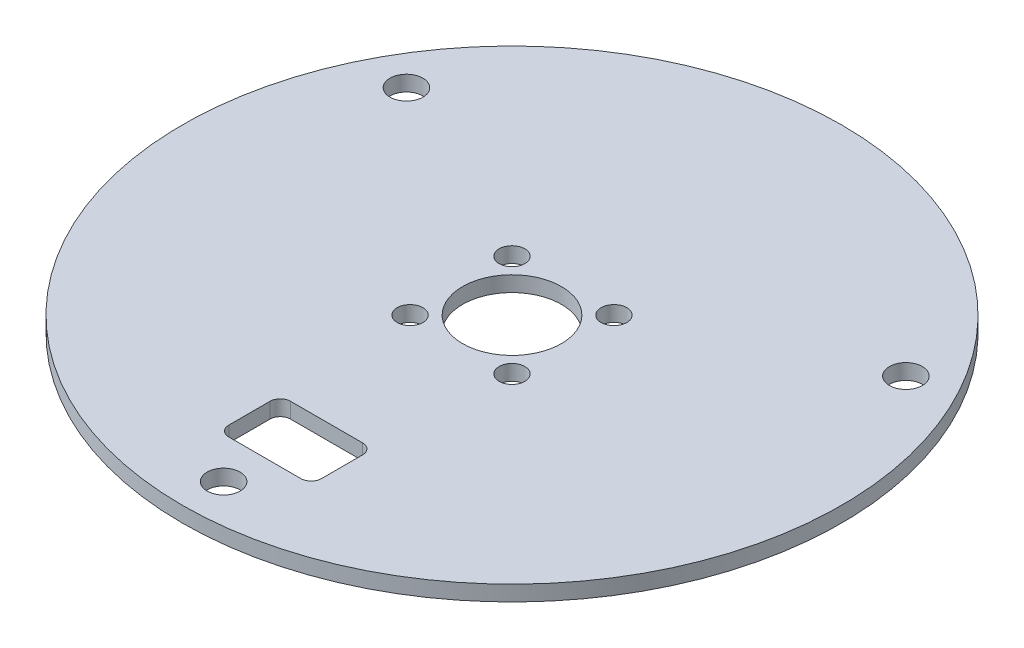
ISO-10303-21;
HEADER;
FILE_DESCRIPTION(('STEP AP214'),'2;1');
FILE_NAME('part.step','',(''),(''),'','','');
FILE_SCHEMA(('AUTOMOTIVE_DESIGN { 1 0 10303 214 1 1 1 1 }'));
ENDSEC;
DATA;
#1=APPLICATION_CONTEXT('core data for automotive mechanical design processes');
#2=APPLICATION_PROTOCOL_DEFINITION('international standard','automotive_design',2000,#1);
#3=PRODUCT_CONTEXT('',#1,'mechanical');
#4=PRODUCT('Part','Part','',(#3));
#5=PRODUCT_RELATED_PRODUCT_CATEGORY('part','',(#4));
#6=PRODUCT_DEFINITION_FORMATION('','',#4);
#7=PRODUCT_DEFINITION_CONTEXT('part definition',#1,'design');
#8=PRODUCT_DEFINITION('design','',#6,#7);
#9=PRODUCT_DEFINITION_SHAPE('','',#8);
#10=(LENGTH_UNIT() NAMED_UNIT(*) SI_UNIT(.MILLI.,.METRE.));
#11=(NAMED_UNIT(*) PLANE_ANGLE_UNIT() SI_UNIT($,.RADIAN.));
#12=(NAMED_UNIT(*) SI_UNIT($,.STERADIAN.) SOLID_ANGLE_UNIT());
#13=UNCERTAINTY_MEASURE_WITH_UNIT(LENGTH_MEASURE(1.E-05),#10,'distance_accuracy_value','');
#14=(GEOMETRIC_REPRESENTATION_CONTEXT(3) GLOBAL_UNCERTAINTY_ASSIGNED_CONTEXT((#13)) GLOBAL_UNIT_ASSIGNED_CONTEXT((#10,
#11,#12)) REPRESENTATION_CONTEXT('',''));
#15=CARTESIAN_POINT('',(0.,0.,0.));
#16=DIRECTION('',(0.,0.,1.));
#17=DIRECTION('',(1.,0.,0.));
#18=AXIS2_PLACEMENT_3D('',#15,#16,#17);
#19=CARTESIAN_POINT('',(0.,-1.5,0.));
#20=DIRECTION('',(0.,1.,0.));
#21=DIRECTION('',(0.,0.,1.));
#22=AXIS2_PLACEMENT_3D('',#19,#20,#21);
#23=CYLINDRICAL_SURFACE('',#22,32.);
#24=CARTESIAN_POINT('',(0.,-1.5,0.));
#25=DIRECTION('',(0.,1.,0.));
#26=DIRECTION('',(0.,0.,1.));
#27=AXIS2_PLACEMENT_3D('',#24,#25,#26);
#28=CIRCLE('',#27,32.);
#29=CARTESIAN_POINT('',(0.,-1.5,32.));
#30=VERTEX_POINT('',#29);
#31=EDGE_CURVE('E200',#30,#30,#28,.T.);
#32=ORIENTED_EDGE('',*,*,#31,.T.);
#33=EDGE_LOOP('',(#32));
#34=FACE_BOUND('',#33,.T.);
#35=CARTESIAN_POINT('',(0.,0.,0.));
#36=DIRECTION('',(0.,1.,0.));
#37=DIRECTION('',(0.,0.,1.));
#38=AXIS2_PLACEMENT_3D('',#35,#36,#37);
#39=CIRCLE('',#38,32.);
#40=CARTESIAN_POINT('',(0.,0.,32.));
#41=VERTEX_POINT('',#40);
#42=EDGE_CURVE('E185',#41,#41,#39,.T.);
#43=ORIENTED_EDGE('',*,*,#42,.F.);
#44=EDGE_LOOP('',(#43));
#45=FACE_BOUND('',#44,.T.);
#46=ADVANCED_FACE('F47',(#34,#45),#23,.T.);
#47=CARTESIAN_POINT('',(0.,-1.5,0.));
#48=DIRECTION('',(0.,1.,0.));
#49=DIRECTION('',(0.,0.,1.));
#50=AXIS2_PLACEMENT_3D('',#47,#48,#49);
#51=PLANE('',#50);
#52=DIRECTION('',(0.,0.,-1.));
#53=VECTOR('',#52,1.);
#54=CARTESIAN_POINT('',(4.5,-1.5,18.));
#55=LINE('',#54,#53);
#56=CARTESIAN_POINT('',(4.5,-1.5,23.));
#57=VERTEX_POINT('',#56);
#58=CARTESIAN_POINT('',(4.5,-1.5,19.));
#59=VERTEX_POINT('',#58);
#60=EDGE_CURVE('E235',#57,#59,#55,.T.);
#61=ORIENTED_EDGE('',*,*,#60,.T.);
#62=CARTESIAN_POINT('',(3.5,-1.5,19.));
#63=DIRECTION('',(0.,1.,0.));
#64=DIRECTION('',(0.,0.,1.));
#65=AXIS2_PLACEMENT_3D('',#62,#63,#64);
#66=CIRCLE('',#65,1.);
#67=CARTESIAN_POINT('',(3.5,-1.5,18.));
#68=VERTEX_POINT('',#67);
#69=EDGE_CURVE('E11',#59,#68,#66,.T.);
#70=ORIENTED_EDGE('',*,*,#69,.T.);
#71=DIRECTION('',(-1.,0.,0.));
#72=VECTOR('',#71,1.);
#73=CARTESIAN_POINT('',(-4.5,-1.5,18.));
#74=LINE('',#73,#72);
#75=CARTESIAN_POINT('',(-3.5,-1.5,18.));
#76=VERTEX_POINT('',#75);
#77=EDGE_CURVE('E175',#68,#76,#74,.T.);
#78=ORIENTED_EDGE('',*,*,#77,.T.);
#79=CARTESIAN_POINT('',(-3.5,-1.5,19.));
#80=DIRECTION('',(0.,1.,0.));
#81=DIRECTION('',(0.,0.,1.));
#82=AXIS2_PLACEMENT_3D('',#79,#80,#81);
#83=CIRCLE('',#82,1.);
#84=CARTESIAN_POINT('',(-4.5,-1.5,19.));
#85=VERTEX_POINT('',#84);
#86=EDGE_CURVE('E224',#76,#85,#83,.T.);
#87=ORIENTED_EDGE('',*,*,#86,.T.);
#88=DIRECTION('',(0.,0.,1.));
#89=VECTOR('',#88,1.);
#90=CARTESIAN_POINT('',(-4.5,-1.5,18.));
#91=LINE('',#90,#89);
#92=CARTESIAN_POINT('',(-4.5,-1.5,23.));
#93=VERTEX_POINT('',#92);
#94=EDGE_CURVE('E149',#85,#93,#91,.T.);
#95=ORIENTED_EDGE('',*,*,#94,.T.);
#96=CARTESIAN_POINT('',(-3.5,-1.5,23.));
#97=DIRECTION('',(0.,1.,0.));
#98=DIRECTION('',(0.,0.,1.));
#99=AXIS2_PLACEMENT_3D('',#96,#97,#98);
#100=CIRCLE('',#99,1.);
#101=CARTESIAN_POINT('',(-3.5,-1.5,24.));
#102=VERTEX_POINT('',#101);
#103=EDGE_CURVE('E122',#93,#102,#100,.T.);
#104=ORIENTED_EDGE('',*,*,#103,.T.);
#105=DIRECTION('',(1.,0.,0.));
#106=VECTOR('',#105,1.);
#107=CARTESIAN_POINT('',(-4.5,-1.5,24.));
#108=LINE('',#107,#106);
#109=CARTESIAN_POINT('',(3.5,-1.5,24.));
#110=VERTEX_POINT('',#109);
#111=EDGE_CURVE('E131',#102,#110,#108,.T.);
#112=ORIENTED_EDGE('',*,*,#111,.T.);
#113=CARTESIAN_POINT('',(3.5,-1.5,23.));
#114=DIRECTION('',(0.,1.,0.));
#115=DIRECTION('',(0.,0.,1.));
#116=AXIS2_PLACEMENT_3D('',#113,#114,#115);
#117=CIRCLE('',#116,1.);
#118=EDGE_CURVE('E220',#110,#57,#117,.T.);
#119=ORIENTED_EDGE('',*,*,#118,.T.);
#120=EDGE_LOOP('',(#61,#70,#78,#87,#95,#104,#112,#119));
#121=FACE_BOUND('',#120,.T.);
#122=CARTESIAN_POINT('',(-4.94974746830583,-1.5,4.94974746830583));
#123=DIRECTION('',(0.,1.,0.));
#124=DIRECTION('',(0.,0.,1.));
#125=AXIS2_PLACEMENT_3D('',#122,#123,#124);
#126=CIRCLE('',#125,1.25);
#127=CARTESIAN_POINT('',(-4.94974746830583,-1.5,6.19974746830583));
#128=VERTEX_POINT('',#127);
#129=EDGE_CURVE('E172',#128,#128,#126,.T.);
#130=ORIENTED_EDGE('',*,*,#129,.T.);
#131=EDGE_LOOP('',(#130));
#132=FACE_BOUND('',#131,.T.);
#133=CARTESIAN_POINT('',(4.94974746830583,-1.5,4.94974746830583));
#134=DIRECTION('',(0.,1.,0.));
#135=DIRECTION('',(0.,0.,1.));
#136=AXIS2_PLACEMENT_3D('',#133,#134,#135);
#137=CIRCLE('',#136,1.25);
#138=CARTESIAN_POINT('',(4.94974746830583,-1.5,6.19974746830583));
#139=VERTEX_POINT('',#138);
#140=EDGE_CURVE('E166',#139,#139,#137,.T.);
#141=ORIENTED_EDGE('',*,*,#140,.T.);
#142=EDGE_LOOP('',(#141));
#143=FACE_BOUND('',#142,.T.);
#144=CARTESIAN_POINT('',(4.94974746830583,-1.5,-4.94974746830583));
#145=DIRECTION('',(0.,1.,0.));
#146=DIRECTION('',(0.,0.,1.));
#147=AXIS2_PLACEMENT_3D('',#144,#145,#146);
#148=CIRCLE('',#147,1.25);
#149=CARTESIAN_POINT('',(4.94974746830583,-1.5,-3.69974746830583));
#150=VERTEX_POINT('',#149);
#151=EDGE_CURVE('E160',#150,#150,#148,.T.);
#152=ORIENTED_EDGE('',*,*,#151,.T.);
#153=EDGE_LOOP('',(#152));
#154=FACE_BOUND('',#153,.T.);
#155=CARTESIAN_POINT('',(-4.94974746830583,-1.5,-4.94974746830583));
#156=DIRECTION('',(0.,1.,0.));
#157=DIRECTION('',(0.,0.,1.));
#158=AXIS2_PLACEMENT_3D('',#155,#156,#157);
#159=CIRCLE('',#158,1.25);
#160=CARTESIAN_POINT('',(-4.94974746830583,-1.5,-3.69974746830583));
#161=VERTEX_POINT('',#160);
#162=EDGE_CURVE('E154',#161,#161,#159,.T.);
#163=ORIENTED_EDGE('',*,*,#162,.T.);
#164=EDGE_LOOP('',(#163));
#165=FACE_BOUND('',#164,.T.);
#166=CARTESIAN_POINT('',(0.,-1.5,0.));
#167=DIRECTION('',(0.,1.,0.));
#168=DIRECTION('',(0.,0.,1.));
#169=AXIS2_PLACEMENT_3D('',#166,#167,#168);
#170=CIRCLE('',#169,4.8);
#171=CARTESIAN_POINT('',(0.,-1.5,4.8));
#172=VERTEX_POINT('',#171);
#173=EDGE_CURVE('E176',#172,#172,#170,.T.);
#174=ORIENTED_EDGE('',*,*,#173,.T.);
#175=EDGE_LOOP('',(#174));
#176=FACE_BOUND('',#175,.T.);
#177=CARTESIAN_POINT('',(0.,-1.5,28.));
#178=DIRECTION('',(0.,1.,0.));
#179=DIRECTION('',(0.,0.,1.));
#180=AXIS2_PLACEMENT_3D('',#177,#178,#179);
#181=CIRCLE('',#180,1.6);
#182=CARTESIAN_POINT('',(0.,-1.5,29.6));
#183=VERTEX_POINT('',#182);
#184=EDGE_CURVE('E182',#183,#183,#181,.T.);
#185=ORIENTED_EDGE('',*,*,#184,.T.);
#186=EDGE_LOOP('',(#185));
#187=FACE_BOUND('',#186,.T.);
#188=CARTESIAN_POINT('',(-24.2487113059642,-1.5,-14.0000000000001));
#189=DIRECTION('',(0.,1.,0.));
#190=DIRECTION('',(0.,0.,1.));
#191=AXIS2_PLACEMENT_3D('',#188,#189,#190);
#192=CIRCLE('',#191,1.6);
#193=CARTESIAN_POINT('',(-24.2487113059642,-1.5,-12.4000000000001));
#194=VERTEX_POINT('',#193);
#195=EDGE_CURVE('E192',#194,#194,#192,.T.);
#196=ORIENTED_EDGE('',*,*,#195,.T.);
#197=EDGE_LOOP('',(#196));
#198=FACE_BOUND('',#197,.T.);
#199=CARTESIAN_POINT('',(24.2487113059644,-1.5,-13.9999999999998));
#200=DIRECTION('',(0.,1.,0.));
#201=DIRECTION('',(0.,0.,1.));
#202=AXIS2_PLACEMENT_3D('',#199,#200,#201);
#203=CIRCLE('',#202,1.6);
#204=CARTESIAN_POINT('',(24.2487113059644,-1.5,-12.3999999999998));
#205=VERTEX_POINT('',#204);
#206=EDGE_CURVE('E179',#205,#205,#203,.T.);
#207=ORIENTED_EDGE('',*,*,#206,.T.);
#208=EDGE_LOOP('',(#207));
#209=FACE_BOUND('',#208,.T.);
#210=ORIENTED_EDGE('',*,*,#31,.F.);
#211=EDGE_LOOP('',(#210));
#212=FACE_BOUND('',#211,.T.);
#213=ADVANCED_FACE('F241',(#121,#132,#143,#154,#165,#176,#187,#198,#209,#212),#51,.F.);
#214=CARTESIAN_POINT('',(0.,0.,0.));
#215=DIRECTION('',(0.,1.,0.));
#216=DIRECTION('',(0.,0.,1.));
#217=AXIS2_PLACEMENT_3D('',#214,#215,#216);
#218=PLANE('',#217);
#219=DIRECTION('',(0.,0.,1.));
#220=VECTOR('',#219,1.);
#221=CARTESIAN_POINT('',(-4.5,0.,18.));
#222=LINE('',#221,#220);
#223=CARTESIAN_POINT('',(-4.5,0.,19.));
#224=VERTEX_POINT('',#223);
#225=CARTESIAN_POINT('',(-4.5,0.,23.));
#226=VERTEX_POINT('',#225);
#227=EDGE_CURVE('E140',#224,#226,#222,.T.);
#228=ORIENTED_EDGE('',*,*,#227,.F.);
#229=CARTESIAN_POINT('',(-3.5,0.,19.));
#230=DIRECTION('',(0.,1.,0.));
#231=DIRECTION('',(0.,0.,1.));
#232=AXIS2_PLACEMENT_3D('',#229,#230,#231);
#233=CIRCLE('',#232,1.);
#234=CARTESIAN_POINT('',(-3.5,0.,18.));
#235=VERTEX_POINT('',#234);
#236=EDGE_CURVE('E222',#224,#235,#233,.F.);
#237=ORIENTED_EDGE('',*,*,#236,.T.);
#238=DIRECTION('',(-1.,0.,0.));
#239=VECTOR('',#238,1.);
#240=CARTESIAN_POINT('',(-4.5,0.,18.));
#241=LINE('',#240,#239);
#242=CARTESIAN_POINT('',(3.5,0.,18.));
#243=VERTEX_POINT('',#242);
#244=EDGE_CURVE('E143',#243,#235,#241,.T.);
#245=ORIENTED_EDGE('',*,*,#244,.F.);
#246=CARTESIAN_POINT('',(3.5,0.,19.));
#247=DIRECTION('',(0.,1.,0.));
#248=DIRECTION('',(0.,0.,1.));
#249=AXIS2_PLACEMENT_3D('',#246,#247,#248);
#250=CIRCLE('',#249,1.);
#251=CARTESIAN_POINT('',(4.5,0.,19.));
#252=VERTEX_POINT('',#251);
#253=EDGE_CURVE('E55',#243,#252,#250,.F.);
#254=ORIENTED_EDGE('',*,*,#253,.T.);
#255=DIRECTION('',(0.,0.,-1.));
#256=VECTOR('',#255,1.);
#257=CARTESIAN_POINT('',(4.5,0.,18.));
#258=LINE('',#257,#256);
#259=CARTESIAN_POINT('',(4.5,0.,23.));
#260=VERTEX_POINT('',#259);
#261=EDGE_CURVE('E139',#260,#252,#258,.T.);
#262=ORIENTED_EDGE('',*,*,#261,.F.);
#263=CARTESIAN_POINT('',(3.5,0.,23.));
#264=DIRECTION('',(0.,1.,0.));
#265=DIRECTION('',(0.,0.,1.));
#266=AXIS2_PLACEMENT_3D('',#263,#264,#265);
#267=CIRCLE('',#266,1.);
#268=CARTESIAN_POINT('',(3.5,0.,24.));
#269=VERTEX_POINT('',#268);
#270=EDGE_CURVE('E138',#260,#269,#267,.F.);
#271=ORIENTED_EDGE('',*,*,#270,.T.);
#272=DIRECTION('',(1.,0.,0.));
#273=VECTOR('',#272,1.);
#274=CARTESIAN_POINT('',(-4.5,0.,24.));
#275=LINE('',#274,#273);
#276=CARTESIAN_POINT('',(-3.5,0.,24.));
#277=VERTEX_POINT('',#276);
#278=EDGE_CURVE('E128',#277,#269,#275,.T.);
#279=ORIENTED_EDGE('',*,*,#278,.F.);
#280=CARTESIAN_POINT('',(-3.5,0.,23.));
#281=DIRECTION('',(0.,1.,0.));
#282=DIRECTION('',(0.,0.,1.));
#283=AXIS2_PLACEMENT_3D('',#280,#281,#282);
#284=CIRCLE('',#283,1.);
#285=EDGE_CURVE('E112',#277,#226,#284,.F.);
#286=ORIENTED_EDGE('',*,*,#285,.T.);
#287=EDGE_LOOP('',(#228,#237,#245,#254,#262,#271,#279,#286));
#288=FACE_BOUND('',#287,.T.);
#289=CARTESIAN_POINT('',(-4.94974746830583,0.,4.94974746830583));
#290=DIRECTION('',(0.,1.,0.));
#291=DIRECTION('',(0.,0.,1.));
#292=AXIS2_PLACEMENT_3D('',#289,#290,#291);
#293=CIRCLE('',#292,1.25);
#294=CARTESIAN_POINT('',(-4.94974746830583,0.,6.19974746830583));
#295=VERTEX_POINT('',#294);
#296=EDGE_CURVE('E169',#295,#295,#293,.T.);
#297=ORIENTED_EDGE('',*,*,#296,.F.);
#298=EDGE_LOOP('',(#297));
#299=FACE_BOUND('',#298,.T.);
#300=CARTESIAN_POINT('',(4.94974746830583,0.,4.94974746830583));
#301=DIRECTION('',(0.,1.,0.));
#302=DIRECTION('',(0.,0.,1.));
#303=AXIS2_PLACEMENT_3D('',#300,#301,#302);
#304=CIRCLE('',#303,1.25);
#305=CARTESIAN_POINT('',(4.94974746830583,0.,6.19974746830583));
#306=VERTEX_POINT('',#305);
#307=EDGE_CURVE('E163',#306,#306,#304,.T.);
#308=ORIENTED_EDGE('',*,*,#307,.F.);
#309=EDGE_LOOP('',(#308));
#310=FACE_BOUND('',#309,.T.);
#311=CARTESIAN_POINT('',(4.94974746830583,0.,-4.94974746830583));
#312=DIRECTION('',(0.,1.,0.));
#313=DIRECTION('',(0.,0.,1.));
#314=AXIS2_PLACEMENT_3D('',#311,#312,#313);
#315=CIRCLE('',#314,1.25);
#316=CARTESIAN_POINT('',(4.94974746830583,0.,-3.69974746830583));
#317=VERTEX_POINT('',#316);
#318=EDGE_CURVE('E157',#317,#317,#315,.T.);
#319=ORIENTED_EDGE('',*,*,#318,.F.);
#320=EDGE_LOOP('',(#319));
#321=FACE_BOUND('',#320,.T.);
#322=CARTESIAN_POINT('',(-4.94974746830583,0.,-4.94974746830583));
#323=DIRECTION('',(0.,1.,0.));
#324=DIRECTION('',(0.,0.,1.));
#325=AXIS2_PLACEMENT_3D('',#322,#323,#324);
#326=CIRCLE('',#325,1.25);
#327=CARTESIAN_POINT('',(-4.94974746830583,0.,-3.69974746830583));
#328=VERTEX_POINT('',#327);
#329=EDGE_CURVE('E150',#328,#328,#326,.T.);
#330=ORIENTED_EDGE('',*,*,#329,.F.);
#331=EDGE_LOOP('',(#330));
#332=FACE_BOUND('',#331,.T.);
#333=CARTESIAN_POINT('',(0.,0.,0.));
#334=DIRECTION('',(0.,1.,0.));
#335=DIRECTION('',(0.,0.,1.));
#336=AXIS2_PLACEMENT_3D('',#333,#334,#335);
#337=CIRCLE('',#336,4.8);
#338=CARTESIAN_POINT('',(0.,0.,4.8));
#339=VERTEX_POINT('',#338);
#340=EDGE_CURVE('E153',#339,#339,#337,.T.);
#341=ORIENTED_EDGE('',*,*,#340,.F.);
#342=EDGE_LOOP('',(#341));
#343=FACE_BOUND('',#342,.T.);
#344=CARTESIAN_POINT('',(0.,0.,28.));
#345=DIRECTION('',(0.,1.,0.));
#346=DIRECTION('',(0.,0.,1.));
#347=AXIS2_PLACEMENT_3D('',#344,#345,#346);
#348=CIRCLE('',#347,1.6);
#349=CARTESIAN_POINT('',(0.,0.,29.6));
#350=VERTEX_POINT('',#349);
#351=EDGE_CURVE('E186',#350,#350,#348,.T.);
#352=ORIENTED_EDGE('',*,*,#351,.F.);
#353=EDGE_LOOP('',(#352));
#354=FACE_BOUND('',#353,.T.);
#355=CARTESIAN_POINT('',(-24.2487113059642,0.,-14.0000000000001));
#356=DIRECTION('',(0.,1.,0.));
#357=DIRECTION('',(0.,0.,1.));
#358=AXIS2_PLACEMENT_3D('',#355,#356,#357);
#359=CIRCLE('',#358,1.6);
#360=CARTESIAN_POINT('',(-24.2487113059642,0.,-12.4000000000001));
#361=VERTEX_POINT('',#360);
#362=EDGE_CURVE('E189',#361,#361,#359,.T.);
#363=ORIENTED_EDGE('',*,*,#362,.F.);
#364=EDGE_LOOP('',(#363));
#365=FACE_BOUND('',#364,.T.);
#366=CARTESIAN_POINT('',(24.2487113059644,0.,-13.9999999999998));
#367=DIRECTION('',(0.,1.,0.));
#368=DIRECTION('',(0.,0.,1.));
#369=AXIS2_PLACEMENT_3D('',#366,#367,#368);
#370=CIRCLE('',#369,1.6);
#371=CARTESIAN_POINT('',(24.2487113059644,0.,-12.3999999999998));
#372=VERTEX_POINT('',#371);
#373=EDGE_CURVE('E195',#372,#372,#370,.T.);
#374=ORIENTED_EDGE('',*,*,#373,.F.);
#375=EDGE_LOOP('',(#374));
#376=FACE_BOUND('',#375,.T.);
#377=ORIENTED_EDGE('',*,*,#42,.T.);
#378=EDGE_LOOP('',(#377));
#379=FACE_BOUND('',#378,.T.);
#380=ADVANCED_FACE('F135',(#288,#299,#310,#321,#332,#343,#354,#365,#376,#379),#218,.T.);
#381=CARTESIAN_POINT('',(24.2487113059644,-1.5,-13.9999999999998));
#382=DIRECTION('',(0.,1.,0.));
#383=DIRECTION('',(0.,0.,1.));
#384=AXIS2_PLACEMENT_3D('',#381,#382,#383);
#385=CYLINDRICAL_SURFACE('',#384,1.6);
#386=ORIENTED_EDGE('',*,*,#206,.F.);
#387=EDGE_LOOP('',(#386));
#388=FACE_BOUND('',#387,.T.);
#389=ORIENTED_EDGE('',*,*,#373,.T.);
#390=EDGE_LOOP('',(#389));
#391=FACE_BOUND('',#390,.T.);
#392=ADVANCED_FACE('F306',(#388,#391),#385,.F.);
#393=CARTESIAN_POINT('',(-24.2487113059642,-1.5,-14.0000000000001));
#394=DIRECTION('',(0.,1.,0.));
#395=DIRECTION('',(0.,0.,1.));
#396=AXIS2_PLACEMENT_3D('',#393,#394,#395);
#397=CYLINDRICAL_SURFACE('',#396,1.6);
#398=ORIENTED_EDGE('',*,*,#195,.F.);
#399=EDGE_LOOP('',(#398));
#400=FACE_BOUND('',#399,.T.);
#401=ORIENTED_EDGE('',*,*,#362,.T.);
#402=EDGE_LOOP('',(#401));
#403=FACE_BOUND('',#402,.T.);
#404=ADVANCED_FACE('F302',(#400,#403),#397,.F.);
#405=CARTESIAN_POINT('',(0.,-1.5,28.));
#406=DIRECTION('',(0.,1.,0.));
#407=DIRECTION('',(0.,0.,1.));
#408=AXIS2_PLACEMENT_3D('',#405,#406,#407);
#409=CYLINDRICAL_SURFACE('',#408,1.6);
#410=ORIENTED_EDGE('',*,*,#184,.F.);
#411=EDGE_LOOP('',(#410));
#412=FACE_BOUND('',#411,.T.);
#413=ORIENTED_EDGE('',*,*,#351,.T.);
#414=EDGE_LOOP('',(#413));
#415=FACE_BOUND('',#414,.T.);
#416=ADVANCED_FACE('F298',(#412,#415),#409,.F.);
#417=CARTESIAN_POINT('',(0.,-1.5,0.));
#418=DIRECTION('',(0.,1.,0.));
#419=DIRECTION('',(0.,0.,1.));
#420=AXIS2_PLACEMENT_3D('',#417,#418,#419);
#421=CYLINDRICAL_SURFACE('',#420,4.8);
#422=ORIENTED_EDGE('',*,*,#173,.F.);
#423=EDGE_LOOP('',(#422));
#424=FACE_BOUND('',#423,.T.);
#425=ORIENTED_EDGE('',*,*,#340,.T.);
#426=EDGE_LOOP('',(#425));
#427=FACE_BOUND('',#426,.T.);
#428=ADVANCED_FACE('F284',(#424,#427),#421,.F.);
#429=CARTESIAN_POINT('',(-4.94974746830583,-1.5,-4.94974746830583));
#430=DIRECTION('',(0.,1.,0.));
#431=DIRECTION('',(0.,0.,1.));
#432=AXIS2_PLACEMENT_3D('',#429,#430,#431);
#433=CYLINDRICAL_SURFACE('',#432,1.25);
#434=ORIENTED_EDGE('',*,*,#162,.F.);
#435=EDGE_LOOP('',(#434));
#436=FACE_BOUND('',#435,.T.);
#437=ORIENTED_EDGE('',*,*,#329,.T.);
#438=EDGE_LOOP('',(#437));
#439=FACE_BOUND('',#438,.T.);
#440=ADVANCED_FACE('F280',(#436,#439),#433,.F.);
#441=CARTESIAN_POINT('',(4.94974746830583,-1.5,-4.94974746830583));
#442=DIRECTION('',(0.,1.,0.));
#443=DIRECTION('',(0.,0.,1.));
#444=AXIS2_PLACEMENT_3D('',#441,#442,#443);
#445=CYLINDRICAL_SURFACE('',#444,1.25);
#446=ORIENTED_EDGE('',*,*,#151,.F.);
#447=EDGE_LOOP('',(#446));
#448=FACE_BOUND('',#447,.T.);
#449=ORIENTED_EDGE('',*,*,#318,.T.);
#450=EDGE_LOOP('',(#449));
#451=FACE_BOUND('',#450,.T.);
#452=ADVANCED_FACE('F283',(#448,#451),#445,.F.);
#453=CARTESIAN_POINT('',(4.94974746830583,-1.5,4.94974746830583));
#454=DIRECTION('',(0.,1.,0.));
#455=DIRECTION('',(0.,0.,1.));
#456=AXIS2_PLACEMENT_3D('',#453,#454,#455);
#457=CYLINDRICAL_SURFACE('',#456,1.25);
#458=ORIENTED_EDGE('',*,*,#140,.F.);
#459=EDGE_LOOP('',(#458));
#460=FACE_BOUND('',#459,.T.);
#461=ORIENTED_EDGE('',*,*,#307,.T.);
#462=EDGE_LOOP('',(#461));
#463=FACE_BOUND('',#462,.T.);
#464=ADVANCED_FACE('F288',(#460,#463),#457,.F.);
#465=CARTESIAN_POINT('',(-4.94974746830583,-1.5,4.94974746830583));
#466=DIRECTION('',(0.,1.,0.));
#467=DIRECTION('',(0.,0.,1.));
#468=AXIS2_PLACEMENT_3D('',#465,#466,#467);
#469=CYLINDRICAL_SURFACE('',#468,1.25);
#470=ORIENTED_EDGE('',*,*,#129,.F.);
#471=EDGE_LOOP('',(#470));
#472=FACE_BOUND('',#471,.T.);
#473=ORIENTED_EDGE('',*,*,#296,.T.);
#474=EDGE_LOOP('',(#473));
#475=FACE_BOUND('',#474,.T.);
#476=ADVANCED_FACE('F279',(#472,#475),#469,.F.);
#477=CARTESIAN_POINT('',(-4.5,-1.5,18.));
#478=DIRECTION('',(-1.,0.,0.));
#479=DIRECTION('',(0.,0.,1.));
#480=AXIS2_PLACEMENT_3D('',#477,#478,#479);
#481=PLANE('',#480);
#482=ORIENTED_EDGE('',*,*,#227,.T.);
#483=DIRECTION('',(0.,1.,0.));
#484=VECTOR('',#483,1.);
#485=CARTESIAN_POINT('',(-4.5,-1.5,23.));
#486=LINE('',#485,#484);
#487=EDGE_CURVE('E117',#226,#93,#486,.F.);
#488=ORIENTED_EDGE('',*,*,#487,.T.);
#489=ORIENTED_EDGE('',*,*,#94,.F.);
#490=DIRECTION('',(0.,1.,0.));
#491=VECTOR('',#490,1.);
#492=CARTESIAN_POINT('',(-4.5,0.,19.));
#493=LINE('',#492,#491);
#494=EDGE_CURVE('E132',#85,#224,#493,.T.);
#495=ORIENTED_EDGE('',*,*,#494,.T.);
#496=EDGE_LOOP('',(#482,#488,#489,#495));
#497=FACE_BOUND('',#496,.T.);
#498=ADVANCED_FACE('F245',(#497),#481,.F.);
#499=CARTESIAN_POINT('',(-4.5,-1.5,18.));
#500=DIRECTION('',(0.,0.,-1.));
#501=DIRECTION('',(-1.,0.,0.));
#502=AXIS2_PLACEMENT_3D('',#499,#500,#501);
#503=PLANE('',#502);
#504=ORIENTED_EDGE('',*,*,#244,.T.);
#505=DIRECTION('',(0.,1.,0.));
#506=VECTOR('',#505,1.);
#507=CARTESIAN_POINT('',(-3.5,-1.5,18.));
#508=LINE('',#507,#506);
#509=EDGE_CURVE('E62',#235,#76,#508,.F.);
#510=ORIENTED_EDGE('',*,*,#509,.T.);
#511=ORIENTED_EDGE('',*,*,#77,.F.);
#512=DIRECTION('',(0.,1.,0.));
#513=VECTOR('',#512,1.);
#514=CARTESIAN_POINT('',(3.5,0.,18.));
#515=LINE('',#514,#513);
#516=EDGE_CURVE('E214',#68,#243,#515,.T.);
#517=ORIENTED_EDGE('',*,*,#516,.T.);
#518=EDGE_LOOP('',(#504,#510,#511,#517));
#519=FACE_BOUND('',#518,.T.);
#520=ADVANCED_FACE('F233',(#519),#503,.F.);
#521=CARTESIAN_POINT('',(4.5,-1.5,18.));
#522=DIRECTION('',(1.,0.,0.));
#523=DIRECTION('',(0.,0.,-1.));
#524=AXIS2_PLACEMENT_3D('',#521,#522,#523);
#525=PLANE('',#524);
#526=ORIENTED_EDGE('',*,*,#60,.F.);
#527=DIRECTION('',(0.,1.,0.));
#528=VECTOR('',#527,1.);
#529=CARTESIAN_POINT('',(4.5,0.,23.));
#530=LINE('',#529,#528);
#531=EDGE_CURVE('E211',#57,#260,#530,.T.);
#532=ORIENTED_EDGE('',*,*,#531,.T.);
#533=ORIENTED_EDGE('',*,*,#261,.T.);
#534=DIRECTION('',(0.,1.,0.));
#535=VECTOR('',#534,1.);
#536=CARTESIAN_POINT('',(4.5,-1.5,19.));
#537=LINE('',#536,#535);
#538=EDGE_CURVE('E209',#252,#59,#537,.F.);
#539=ORIENTED_EDGE('',*,*,#538,.T.);
#540=EDGE_LOOP('',(#526,#532,#533,#539));
#541=FACE_BOUND('',#540,.T.);
#542=ADVANCED_FACE('F231',(#541),#525,.F.);
#543=CARTESIAN_POINT('',(-4.5,-1.5,24.));
#544=DIRECTION('',(0.,0.,1.));
#545=DIRECTION('',(1.,0.,0.));
#546=AXIS2_PLACEMENT_3D('',#543,#544,#545);
#547=PLANE('',#546);
#548=ORIENTED_EDGE('',*,*,#111,.F.);
#549=DIRECTION('',(0.,1.,0.));
#550=VECTOR('',#549,1.);
#551=CARTESIAN_POINT('',(-3.5,0.,24.));
#552=LINE('',#551,#550);
#553=EDGE_CURVE('E116',#102,#277,#552,.T.);
#554=ORIENTED_EDGE('',*,*,#553,.T.);
#555=ORIENTED_EDGE('',*,*,#278,.T.);
#556=DIRECTION('',(0.,1.,0.));
#557=VECTOR('',#556,1.);
#558=CARTESIAN_POINT('',(3.5,-1.5,24.));
#559=LINE('',#558,#557);
#560=EDGE_CURVE('E133',#269,#110,#559,.F.);
#561=ORIENTED_EDGE('',*,*,#560,.T.);
#562=EDGE_LOOP('',(#548,#554,#555,#561));
#563=FACE_BOUND('',#562,.T.);
#564=ADVANCED_FACE('F127',(#563),#547,.F.);
#565=CARTESIAN_POINT('',(-3.5,-1.5,23.));
#566=DIRECTION('',(0.,-1.,0.));
#567=DIRECTION('',(0.,0.,-1.));
#568=AXIS2_PLACEMENT_3D('',#565,#566,#567);
#569=CYLINDRICAL_SURFACE('',#568,1.);
#570=ORIENTED_EDGE('',*,*,#103,.F.);
#571=ORIENTED_EDGE('',*,*,#487,.F.);
#572=ORIENTED_EDGE('',*,*,#285,.F.);
#573=ORIENTED_EDGE('',*,*,#553,.F.);
#574=EDGE_LOOP('',(#570,#571,#572,#573));
#575=FACE_BOUND('',#574,.T.);
#576=ADVANCED_FACE('F115',(#575),#569,.F.);
#577=CARTESIAN_POINT('',(3.5,-1.5,23.));
#578=DIRECTION('',(0.,-1.,0.));
#579=DIRECTION('',(0.,0.,-1.));
#580=AXIS2_PLACEMENT_3D('',#577,#578,#579);
#581=CYLINDRICAL_SURFACE('',#580,1.);
#582=ORIENTED_EDGE('',*,*,#118,.F.);
#583=ORIENTED_EDGE('',*,*,#560,.F.);
#584=ORIENTED_EDGE('',*,*,#270,.F.);
#585=ORIENTED_EDGE('',*,*,#531,.F.);
#586=EDGE_LOOP('',(#582,#583,#584,#585));
#587=FACE_BOUND('',#586,.T.);
#588=ADVANCED_FACE('F249',(#587),#581,.F.);
#589=CARTESIAN_POINT('',(-3.5,-1.5,19.));
#590=DIRECTION('',(0.,-1.,0.));
#591=DIRECTION('',(0.,0.,-1.));
#592=AXIS2_PLACEMENT_3D('',#589,#590,#591);
#593=CYLINDRICAL_SURFACE('',#592,1.);
#594=ORIENTED_EDGE('',*,*,#86,.F.);
#595=ORIENTED_EDGE('',*,*,#509,.F.);
#596=ORIENTED_EDGE('',*,*,#236,.F.);
#597=ORIENTED_EDGE('',*,*,#494,.F.);
#598=EDGE_LOOP('',(#594,#595,#596,#597));
#599=FACE_BOUND('',#598,.T.);
#600=ADVANCED_FACE('F247',(#599),#593,.F.);
#601=CARTESIAN_POINT('',(3.5,-1.5,19.));
#602=DIRECTION('',(0.,-1.,0.));
#603=DIRECTION('',(0.,0.,-1.));
#604=AXIS2_PLACEMENT_3D('',#601,#602,#603);
#605=CYLINDRICAL_SURFACE('',#604,1.);
#606=ORIENTED_EDGE('',*,*,#69,.F.);
#607=ORIENTED_EDGE('',*,*,#538,.F.);
#608=ORIENTED_EDGE('',*,*,#253,.F.);
#609=ORIENTED_EDGE('',*,*,#516,.F.);
#610=EDGE_LOOP('',(#606,#607,#608,#609));
#611=FACE_BOUND('',#610,.T.);
#612=ADVANCED_FACE('F49',(#611),#605,.F.);
#613=CLOSED_SHELL('',(#46,#213,#380,#392,#404,#416,#428,#440,#452,#464,#476,#498,#520,#542,#564,
#576,#588,#600,#612));
#614=MANIFOLD_SOLID_BREP('B2',#613);
#615=ADVANCED_BREP_SHAPE_REPRESENTATION('',(#18,#614),#14);
#616=SHAPE_DEFINITION_REPRESENTATION(#9,#615);
ENDSEC;
END-ISO-10303-21;
